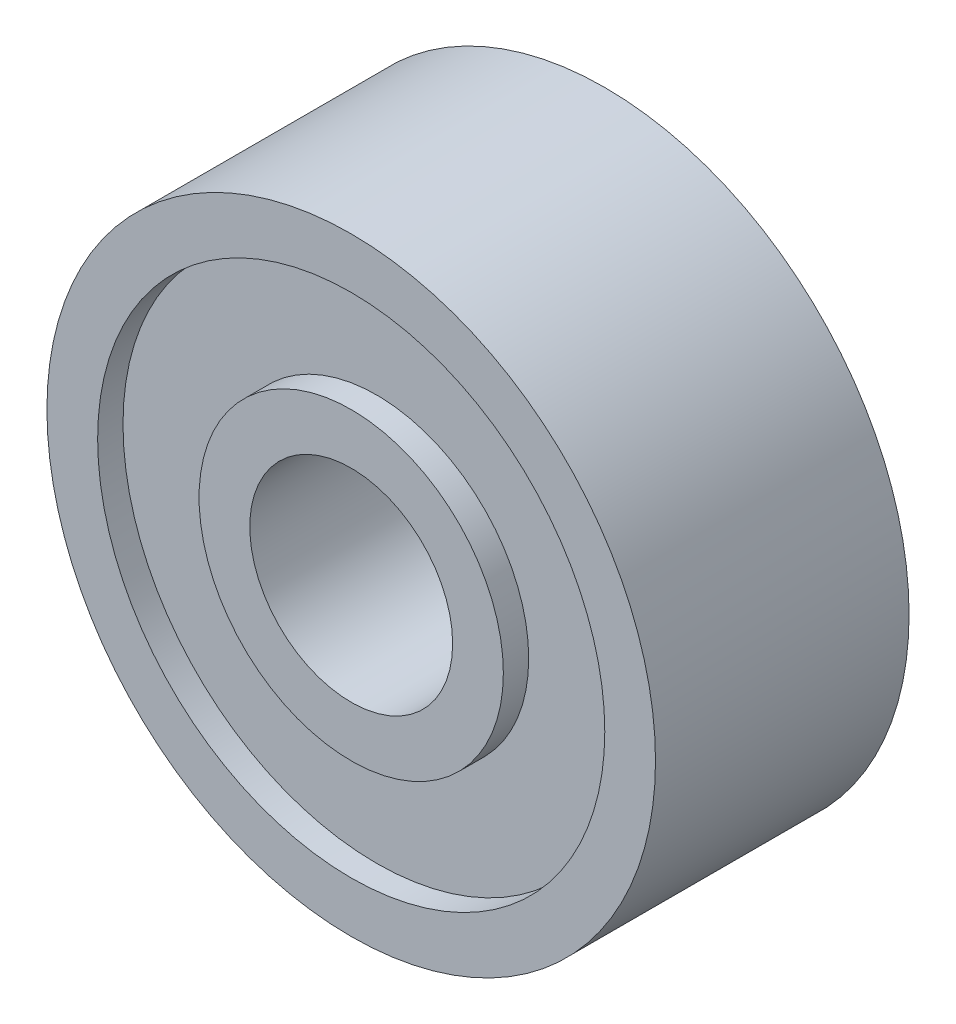
ISO-10303-21;
HEADER;
FILE_DESCRIPTION(('STEP AP214'),'2;1');
FILE_NAME('part.step','',(''),(''),'','','');
FILE_SCHEMA(('AUTOMOTIVE_DESIGN { 1 0 10303 214 1 1 1 1 }'));
ENDSEC;
DATA;
#1=APPLICATION_CONTEXT('core data for automotive mechanical design processes');
#2=APPLICATION_PROTOCOL_DEFINITION('international standard','automotive_design',2000,#1);
#3=PRODUCT_CONTEXT('',#1,'mechanical');
#4=PRODUCT('Part','Part','',(#3));
#5=PRODUCT_RELATED_PRODUCT_CATEGORY('part','',(#4));
#6=PRODUCT_DEFINITION_FORMATION('','',#4);
#7=PRODUCT_DEFINITION_CONTEXT('part definition',#1,'design');
#8=PRODUCT_DEFINITION('design','',#6,#7);
#9=PRODUCT_DEFINITION_SHAPE('','',#8);
#10=(LENGTH_UNIT() NAMED_UNIT(*) SI_UNIT(.MILLI.,.METRE.));
#11=(NAMED_UNIT(*) PLANE_ANGLE_UNIT() SI_UNIT($,.RADIAN.));
#12=(NAMED_UNIT(*) SI_UNIT($,.STERADIAN.) SOLID_ANGLE_UNIT());
#13=UNCERTAINTY_MEASURE_WITH_UNIT(LENGTH_MEASURE(1.E-05),#10,'distance_accuracy_value','');
#14=(GEOMETRIC_REPRESENTATION_CONTEXT(3) GLOBAL_UNCERTAINTY_ASSIGNED_CONTEXT((#13)) GLOBAL_UNIT_ASSIGNED_CONTEXT((#10,
#11,#12)) REPRESENTATION_CONTEXT('',''));
#15=CARTESIAN_POINT('',(0.,0.,0.));
#16=DIRECTION('',(0.,0.,1.));
#17=DIRECTION('',(1.,0.,0.));
#18=AXIS2_PLACEMENT_3D('',#15,#16,#17);
#19=CARTESIAN_POINT('',(0.,0.,-2.5));
#20=DIRECTION('',(0.,0.,1.));
#21=DIRECTION('',(1.,0.,0.));
#22=AXIS2_PLACEMENT_3D('',#19,#20,#21);
#23=CYLINDRICAL_SURFACE('',#22,5.);
#24=CARTESIAN_POINT('',(0.,0.,-2.5));
#25=DIRECTION('',(0.,0.,1.));
#26=DIRECTION('',(1.,0.,0.));
#27=AXIS2_PLACEMENT_3D('',#24,#25,#26);
#28=CIRCLE('',#27,5.);
#29=CARTESIAN_POINT('',(5.,0.,-2.5));
#30=VERTEX_POINT('',#29);
#31=EDGE_CURVE('E53',#30,#30,#28,.T.);
#32=ORIENTED_EDGE('',*,*,#31,.F.);
#33=EDGE_LOOP('',(#32));
#34=FACE_BOUND('',#33,.T.);
#35=CARTESIAN_POINT('',(0.,0.,-2.));
#36=DIRECTION('',(0.,0.,1.));
#37=DIRECTION('',(1.,0.,0.));
#38=AXIS2_PLACEMENT_3D('',#35,#36,#37);
#39=CIRCLE('',#38,5.);
#40=CARTESIAN_POINT('',(5.,0.,-2.));
#41=VERTEX_POINT('',#40);
#42=EDGE_CURVE('E11',#41,#41,#39,.F.);
#43=ORIENTED_EDGE('',*,*,#42,.F.);
#44=EDGE_LOOP('',(#43));
#45=FACE_BOUND('',#44,.T.);
#46=ADVANCED_FACE('F42',(#34,#45),#23,.F.);
#47=CARTESIAN_POINT('',(0.,0.,2.));
#48=DIRECTION('',(0.,0.,1.));
#49=DIRECTION('',(1.,0.,0.));
#50=AXIS2_PLACEMENT_3D('',#47,#48,#49);
#51=CIRCLE('',#50,5.);
#52=CARTESIAN_POINT('',(5.,0.,2.));
#53=VERTEX_POINT('',#52);
#54=EDGE_CURVE('E65',#53,#53,#51,.T.);
#55=ORIENTED_EDGE('',*,*,#54,.F.);
#56=EDGE_LOOP('',(#55));
#57=FACE_BOUND('',#56,.T.);
#58=CARTESIAN_POINT('',(0.,0.,2.5));
#59=DIRECTION('',(0.,0.,1.));
#60=DIRECTION('',(1.,0.,0.));
#61=AXIS2_PLACEMENT_3D('',#58,#59,#60);
#62=CIRCLE('',#61,5.);
#63=CARTESIAN_POINT('',(5.,0.,2.5));
#64=VERTEX_POINT('',#63);
#65=EDGE_CURVE('E62',#64,#64,#62,.T.);
#66=ORIENTED_EDGE('',*,*,#65,.T.);
#67=EDGE_LOOP('',(#66));
#68=FACE_BOUND('',#67,.T.);
#69=ADVANCED_FACE('F44',(#57,#68),#23,.F.);
#70=CARTESIAN_POINT('',(0.,0.,-2.5));
#71=DIRECTION('',(0.,0.,1.));
#72=DIRECTION('',(1.,0.,0.));
#73=AXIS2_PLACEMENT_3D('',#70,#71,#72);
#74=CYLINDRICAL_SURFACE('',#73,6.);
#75=CARTESIAN_POINT('',(0.,0.,-2.5));
#76=DIRECTION('',(0.,0.,1.));
#77=DIRECTION('',(1.,0.,0.));
#78=AXIS2_PLACEMENT_3D('',#75,#76,#77);
#79=CIRCLE('',#78,6.);
#80=CARTESIAN_POINT('',(6.,0.,-2.5));
#81=VERTEX_POINT('',#80);
#82=EDGE_CURVE('E49',#81,#81,#79,.T.);
#83=ORIENTED_EDGE('',*,*,#82,.T.);
#84=EDGE_LOOP('',(#83));
#85=FACE_BOUND('',#84,.T.);
#86=CARTESIAN_POINT('',(0.,0.,2.5));
#87=DIRECTION('',(0.,0.,1.));
#88=DIRECTION('',(1.,0.,0.));
#89=AXIS2_PLACEMENT_3D('',#86,#87,#88);
#90=CIRCLE('',#89,6.);
#91=CARTESIAN_POINT('',(6.,0.,2.5));
#92=VERTEX_POINT('',#91);
#93=EDGE_CURVE('E57',#92,#92,#90,.T.);
#94=ORIENTED_EDGE('',*,*,#93,.F.);
#95=EDGE_LOOP('',(#94));
#96=FACE_BOUND('',#95,.T.);
#97=ADVANCED_FACE('F117',(#85,#96),#74,.T.);
#98=CARTESIAN_POINT('',(0.,0.,-2.5));
#99=DIRECTION('',(0.,0.,1.));
#100=DIRECTION('',(1.,0.,0.));
#101=AXIS2_PLACEMENT_3D('',#98,#99,#100);
#102=PLANE('',#101);
#103=ORIENTED_EDGE('',*,*,#31,.T.);
#104=EDGE_LOOP('',(#103));
#105=FACE_BOUND('',#104,.T.);
#106=ORIENTED_EDGE('',*,*,#82,.F.);
#107=EDGE_LOOP('',(#106));
#108=FACE_BOUND('',#107,.T.);
#109=ADVANCED_FACE('F122',(#105,#108),#102,.F.);
#110=CARTESIAN_POINT('',(0.,0.,2.5));
#111=DIRECTION('',(0.,0.,1.));
#112=DIRECTION('',(1.,0.,0.));
#113=AXIS2_PLACEMENT_3D('',#110,#111,#112);
#114=PLANE('',#113);
#115=ORIENTED_EDGE('',*,*,#65,.F.);
#116=EDGE_LOOP('',(#115));
#117=FACE_BOUND('',#116,.T.);
#118=ORIENTED_EDGE('',*,*,#93,.T.);
#119=EDGE_LOOP('',(#118));
#120=FACE_BOUND('',#119,.T.);
#121=ADVANCED_FACE('F125',(#117,#120),#114,.T.);
#122=CARTESIAN_POINT('',(0.,0.,-2.));
#123=DIRECTION('',(0.,0.,1.));
#124=DIRECTION('',(1.,0.,0.));
#125=AXIS2_PLACEMENT_3D('',#122,#123,#124);
#126=PLANE('',#125);
#127=CARTESIAN_POINT('',(0.,0.,-2.));
#128=DIRECTION('',(0.,0.,1.));
#129=DIRECTION('',(1.,0.,0.));
#130=AXIS2_PLACEMENT_3D('',#127,#128,#129);
#131=CIRCLE('',#130,3.);
#132=CARTESIAN_POINT('',(3.,0.,-2.));
#133=VERTEX_POINT('',#132);
#134=EDGE_CURVE('E71',#133,#133,#131,.T.);
#135=ORIENTED_EDGE('',*,*,#134,.T.);
#136=EDGE_LOOP('',(#135));
#137=FACE_BOUND('',#136,.T.);
#138=ORIENTED_EDGE('',*,*,#42,.T.);
#139=EDGE_LOOP('',(#138));
#140=FACE_BOUND('',#139,.T.);
#141=ADVANCED_FACE('F131',(#137,#140),#126,.F.);
#142=CARTESIAN_POINT('',(0.,0.,2.));
#143=DIRECTION('',(0.,0.,1.));
#144=DIRECTION('',(1.,0.,0.));
#145=AXIS2_PLACEMENT_3D('',#142,#143,#144);
#146=PLANE('',#145);
#147=CARTESIAN_POINT('',(0.,0.,2.));
#148=DIRECTION('',(0.,0.,1.));
#149=DIRECTION('',(1.,0.,0.));
#150=AXIS2_PLACEMENT_3D('',#147,#148,#149);
#151=CIRCLE('',#150,3.);
#152=CARTESIAN_POINT('',(3.,0.,2.));
#153=VERTEX_POINT('',#152);
#154=EDGE_CURVE('E68',#153,#153,#151,.T.);
#155=ORIENTED_EDGE('',*,*,#154,.F.);
#156=EDGE_LOOP('',(#155));
#157=FACE_BOUND('',#156,.T.);
#158=ORIENTED_EDGE('',*,*,#54,.T.);
#159=EDGE_LOOP('',(#158));
#160=FACE_BOUND('',#159,.T.);
#161=ADVANCED_FACE('F110',(#157,#160),#146,.T.);
#162=CARTESIAN_POINT('',(0.,0.,-2.5));
#163=DIRECTION('',(0.,0.,1.));
#164=DIRECTION('',(1.,0.,0.));
#165=AXIS2_PLACEMENT_3D('',#162,#163,#164);
#166=CYLINDRICAL_SURFACE('',#165,3.);
#167=CARTESIAN_POINT('',(0.,0.,-2.5));
#168=DIRECTION('',(0.,0.,1.));
#169=DIRECTION('',(1.,0.,0.));
#170=AXIS2_PLACEMENT_3D('',#167,#168,#169);
#171=CIRCLE('',#170,3.);
#172=CARTESIAN_POINT('',(3.,0.,-2.5));
#173=VERTEX_POINT('',#172);
#174=EDGE_CURVE('E74',#173,#173,#171,.T.);
#175=ORIENTED_EDGE('',*,*,#174,.T.);
#176=EDGE_LOOP('',(#175));
#177=FACE_BOUND('',#176,.T.);
#178=ORIENTED_EDGE('',*,*,#134,.F.);
#179=EDGE_LOOP('',(#178));
#180=FACE_BOUND('',#179,.T.);
#181=ADVANCED_FACE('F100',(#177,#180),#166,.T.);
#182=CARTESIAN_POINT('',(0.,0.,-2.5));
#183=DIRECTION('',(0.,0.,1.));
#184=DIRECTION('',(1.,0.,0.));
#185=AXIS2_PLACEMENT_3D('',#182,#183,#184);
#186=CYLINDRICAL_SURFACE('',#185,2.);
#187=CARTESIAN_POINT('',(0.,0.,-2.5));
#188=DIRECTION('',(0.,0.,1.));
#189=DIRECTION('',(1.,0.,0.));
#190=AXIS2_PLACEMENT_3D('',#187,#188,#189);
#191=CIRCLE('',#190,2.);
#192=CARTESIAN_POINT('',(2.,0.,-2.5));
#193=VERTEX_POINT('',#192);
#194=EDGE_CURVE('E77',#193,#193,#191,.T.);
#195=ORIENTED_EDGE('',*,*,#194,.F.);
#196=EDGE_LOOP('',(#195));
#197=FACE_BOUND('',#196,.T.);
#198=CARTESIAN_POINT('',(0.,0.,2.5));
#199=DIRECTION('',(0.,0.,1.));
#200=DIRECTION('',(1.,0.,0.));
#201=AXIS2_PLACEMENT_3D('',#198,#199,#200);
#202=CIRCLE('',#201,2.);
#203=CARTESIAN_POINT('',(2.,0.,2.5));
#204=VERTEX_POINT('',#203);
#205=EDGE_CURVE('E83',#204,#204,#202,.T.);
#206=ORIENTED_EDGE('',*,*,#205,.T.);
#207=EDGE_LOOP('',(#206));
#208=FACE_BOUND('',#207,.T.);
#209=ADVANCED_FACE('F87',(#197,#208),#186,.F.);
#210=ORIENTED_EDGE('',*,*,#154,.T.);
#211=EDGE_LOOP('',(#210));
#212=FACE_BOUND('',#211,.T.);
#213=CARTESIAN_POINT('',(0.,0.,2.5));
#214=DIRECTION('',(0.,0.,1.));
#215=DIRECTION('',(1.,0.,0.));
#216=AXIS2_PLACEMENT_3D('',#213,#214,#215);
#217=CIRCLE('',#216,3.);
#218=CARTESIAN_POINT('',(3.,0.,2.5));
#219=VERTEX_POINT('',#218);
#220=EDGE_CURVE('E80',#219,#219,#217,.T.);
#221=ORIENTED_EDGE('',*,*,#220,.F.);
#222=EDGE_LOOP('',(#221));
#223=FACE_BOUND('',#222,.T.);
#224=ADVANCED_FACE('F96',(#212,#223),#166,.T.);
#225=CARTESIAN_POINT('',(0.,0.,-2.5));
#226=DIRECTION('',(0.,0.,1.));
#227=DIRECTION('',(1.,0.,0.));
#228=AXIS2_PLACEMENT_3D('',#225,#226,#227);
#229=PLANE('',#228);
#230=ORIENTED_EDGE('',*,*,#194,.T.);
#231=EDGE_LOOP('',(#230));
#232=FACE_BOUND('',#231,.T.);
#233=ORIENTED_EDGE('',*,*,#174,.F.);
#234=EDGE_LOOP('',(#233));
#235=FACE_BOUND('',#234,.T.);
#236=ADVANCED_FACE('F92',(#232,#235),#229,.F.);
#237=CARTESIAN_POINT('',(0.,0.,2.5));
#238=DIRECTION('',(0.,0.,1.));
#239=DIRECTION('',(1.,0.,0.));
#240=AXIS2_PLACEMENT_3D('',#237,#238,#239);
#241=PLANE('',#240);
#242=ORIENTED_EDGE('',*,*,#205,.F.);
#243=EDGE_LOOP('',(#242));
#244=FACE_BOUND('',#243,.T.);
#245=ORIENTED_EDGE('',*,*,#220,.T.);
#246=EDGE_LOOP('',(#245));
#247=FACE_BOUND('',#246,.T.);
#248=ADVANCED_FACE('F89',(#244,#247),#241,.T.);
#249=CLOSED_SHELL('',(#46,#69,#97,#109,#121,#141,#161,#181,#209,#224,#236,#248));
#250=MANIFOLD_SOLID_BREP('B2',#249);
#251=ADVANCED_BREP_SHAPE_REPRESENTATION('',(#18,#250),#14);
#252=SHAPE_DEFINITION_REPRESENTATION(#9,#251);
ENDSEC;
END-ISO-10303-21;
